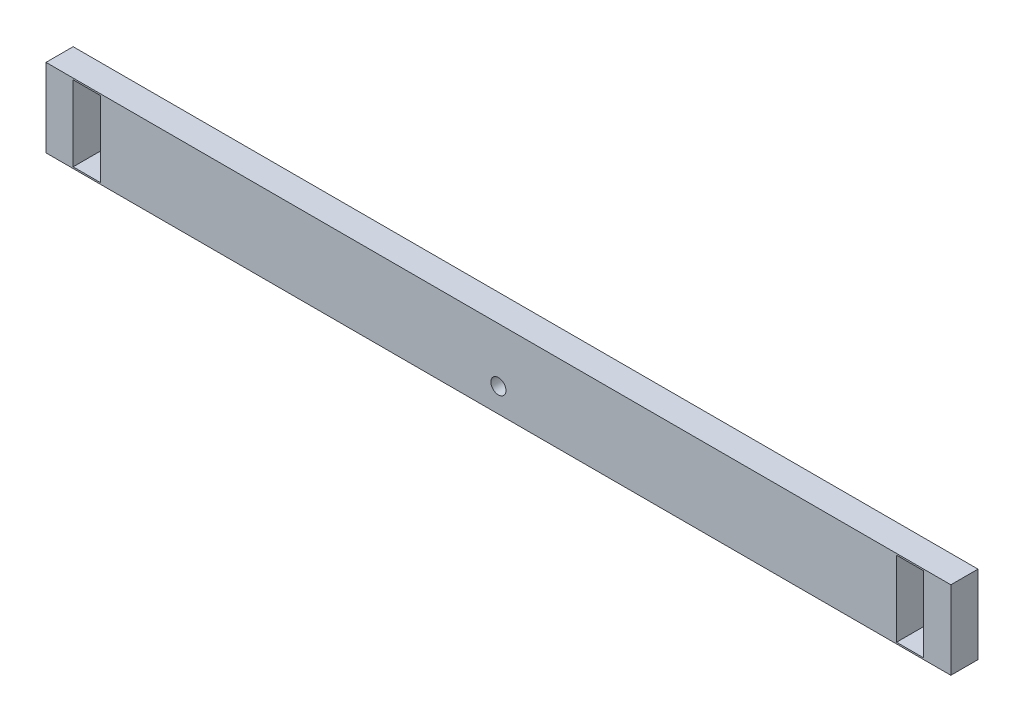
ISO-10303-21;
HEADER;
FILE_DESCRIPTION(('STEP AP214'),'2;1');
FILE_NAME('part.step','',(''),(''),'','','');
FILE_SCHEMA(('AUTOMOTIVE_DESIGN { 1 0 10303 214 1 1 1 1 }'));
ENDSEC;
DATA;
#1=APPLICATION_CONTEXT('core data for automotive mechanical design processes');
#2=APPLICATION_PROTOCOL_DEFINITION('international standard','automotive_design',2000,#1);
#3=PRODUCT_CONTEXT('',#1,'mechanical');
#4=PRODUCT('Part','Part','',(#3));
#5=PRODUCT_RELATED_PRODUCT_CATEGORY('part','',(#4));
#6=PRODUCT_DEFINITION_FORMATION('','',#4);
#7=PRODUCT_DEFINITION_CONTEXT('part definition',#1,'design');
#8=PRODUCT_DEFINITION('design','',#6,#7);
#9=PRODUCT_DEFINITION_SHAPE('','',#8);
#10=(LENGTH_UNIT() NAMED_UNIT(*) SI_UNIT(.MILLI.,.METRE.));
#11=(NAMED_UNIT(*) PLANE_ANGLE_UNIT() SI_UNIT($,.RADIAN.));
#12=(NAMED_UNIT(*) SI_UNIT($,.STERADIAN.) SOLID_ANGLE_UNIT());
#13=UNCERTAINTY_MEASURE_WITH_UNIT(LENGTH_MEASURE(1.E-05),#10,'distance_accuracy_value','');
#14=(GEOMETRIC_REPRESENTATION_CONTEXT(3) GLOBAL_UNCERTAINTY_ASSIGNED_CONTEXT((#13)) GLOBAL_UNIT_ASSIGNED_CONTEXT((#10,
#11,#12)) REPRESENTATION_CONTEXT('',''));
#15=CARTESIAN_POINT('',(0.,0.,0.));
#16=DIRECTION('',(0.,0.,1.));
#17=DIRECTION('',(1.,0.,0.));
#18=AXIS2_PLACEMENT_3D('',#15,#16,#17);
#19=CARTESIAN_POINT('',(0.,0.,18.));
#20=DIRECTION('',(0.,0.,1.));
#21=DIRECTION('',(1.,0.,0.));
#22=AXIS2_PLACEMENT_3D('',#19,#20,#21);
#23=PLANE('',#22);
#24=DIRECTION('',(0.,-1.,0.));
#25=VECTOR('',#24,1.);
#26=CARTESIAN_POINT('',(0.,0.,18.));
#27=LINE('',#26,#25);
#28=CARTESIAN_POINT('',(0.,0.,18.));
#29=VERTEX_POINT('',#28);
#30=CARTESIAN_POINT('',(0.,-52.,18.));
#31=VERTEX_POINT('',#30);
#32=EDGE_CURVE('E197',#29,#31,#27,.T.);
#33=ORIENTED_EDGE('',*,*,#32,.T.);
#34=DIRECTION('',(1.,0.,0.));
#35=VECTOR('',#34,1.);
#36=CARTESIAN_POINT('',(0.,-52.,18.));
#37=LINE('',#36,#35);
#38=CARTESIAN_POINT('',(600.,-51.9999999999999,18.));
#39=VERTEX_POINT('',#38);
#40=EDGE_CURVE('E200',#31,#39,#37,.T.);
#41=ORIENTED_EDGE('',*,*,#40,.T.);
#42=DIRECTION('',(0.,1.,0.));
#43=VECTOR('',#42,1.);
#44=CARTESIAN_POINT('',(600.,0.,18.));
#45=LINE('',#44,#43);
#46=CARTESIAN_POINT('',(600.,0.,18.));
#47=VERTEX_POINT('',#46);
#48=EDGE_CURVE('E203',#39,#47,#45,.T.);
#49=ORIENTED_EDGE('',*,*,#48,.T.);
#50=DIRECTION('',(-1.,0.,0.));
#51=VECTOR('',#50,1.);
#52=CARTESIAN_POINT('',(0.,0.,18.));
#53=LINE('',#52,#51);
#54=EDGE_CURVE('E205',#47,#29,#53,.T.);
#55=ORIENTED_EDGE('',*,*,#54,.T.);
#56=EDGE_LOOP('',(#33,#41,#49,#55));
#57=FACE_BOUND('',#56,.T.);
#58=CARTESIAN_POINT('',(300.,-36.,18.));
#59=DIRECTION('',(0.,0.,1.));
#60=DIRECTION('',(1.,0.,0.));
#61=AXIS2_PLACEMENT_3D('',#58,#59,#60);
#62=CIRCLE('',#61,4.99999999999999);
#63=CARTESIAN_POINT('',(305.,-36.,18.));
#64=VERTEX_POINT('',#63);
#65=EDGE_CURVE('E191',#64,#64,#62,.T.);
#66=ORIENTED_EDGE('',*,*,#65,.F.);
#67=EDGE_LOOP('',(#66));
#68=FACE_BOUND('',#67,.T.);
#69=DIRECTION('',(-1.,0.,0.));
#70=VECTOR('',#69,1.);
#71=CARTESIAN_POINT('',(18.,-0.99999999999998,18.));
#72=LINE('',#71,#70);
#73=CARTESIAN_POINT('',(36.,-0.99999999999998,18.));
#74=VERTEX_POINT('',#73);
#75=CARTESIAN_POINT('',(18.,-0.99999999999998,18.));
#76=VERTEX_POINT('',#75);
#77=EDGE_CURVE('E162',#74,#76,#72,.T.);
#78=ORIENTED_EDGE('',*,*,#77,.F.);
#79=DIRECTION('',(0.,1.,0.));
#80=VECTOR('',#79,1.);
#81=CARTESIAN_POINT('',(36.,-0.99999999999998,18.));
#82=LINE('',#81,#80);
#83=CARTESIAN_POINT('',(36.,-51.,18.));
#84=VERTEX_POINT('',#83);
#85=EDGE_CURVE('E160',#84,#74,#82,.T.);
#86=ORIENTED_EDGE('',*,*,#85,.F.);
#87=DIRECTION('',(1.,0.,0.));
#88=VECTOR('',#87,1.);
#89=CARTESIAN_POINT('',(18.,-51.,18.));
#90=LINE('',#89,#88);
#91=CARTESIAN_POINT('',(18.,-51.,18.));
#92=VERTEX_POINT('',#91);
#93=EDGE_CURVE('E168',#92,#84,#90,.T.);
#94=ORIENTED_EDGE('',*,*,#93,.F.);
#95=DIRECTION('',(0.,-1.,0.));
#96=VECTOR('',#95,1.);
#97=CARTESIAN_POINT('',(18.,-0.99999999999998,18.));
#98=LINE('',#97,#96);
#99=EDGE_CURVE('E165',#76,#92,#98,.T.);
#100=ORIENTED_EDGE('',*,*,#99,.F.);
#101=EDGE_LOOP('',(#78,#86,#94,#100));
#102=FACE_BOUND('',#101,.T.);
#103=DIRECTION('',(-1.,0.,0.));
#104=VECTOR('',#103,1.);
#105=CARTESIAN_POINT('',(582.,-0.999999999999911,18.));
#106=LINE('',#105,#104);
#107=CARTESIAN_POINT('',(582.,-0.999999999999911,18.));
#108=VERTEX_POINT('',#107);
#109=CARTESIAN_POINT('',(564.,-0.999999999999914,18.));
#110=VERTEX_POINT('',#109);
#111=EDGE_CURVE('E132',#108,#110,#106,.T.);
#112=ORIENTED_EDGE('',*,*,#111,.F.);
#113=DIRECTION('',(0.,1.,0.));
#114=VECTOR('',#113,1.);
#115=CARTESIAN_POINT('',(582.,-0.999999999999911,18.));
#116=LINE('',#115,#114);
#117=CARTESIAN_POINT('',(582.,-50.9999999999999,18.));
#118=VERTEX_POINT('',#117);
#119=EDGE_CURVE('E124',#118,#108,#116,.T.);
#120=ORIENTED_EDGE('',*,*,#119,.F.);
#121=DIRECTION('',(1.,0.,0.));
#122=VECTOR('',#121,1.);
#123=CARTESIAN_POINT('',(582.,-50.9999999999999,18.));
#124=LINE('',#123,#122);
#125=CARTESIAN_POINT('',(564.,-50.9999999999999,18.));
#126=VERTEX_POINT('',#125);
#127=EDGE_CURVE('E146',#126,#118,#124,.T.);
#128=ORIENTED_EDGE('',*,*,#127,.F.);
#129=DIRECTION('',(0.,-1.,0.));
#130=VECTOR('',#129,1.);
#131=CARTESIAN_POINT('',(564.,-0.999999999999914,18.));
#132=LINE('',#131,#130);
#133=EDGE_CURVE('E144',#110,#126,#132,.T.);
#134=ORIENTED_EDGE('',*,*,#133,.F.);
#135=EDGE_LOOP('',(#112,#120,#128,#134));
#136=FACE_BOUND('',#135,.T.);
#137=ADVANCED_FACE('F35',(#57,#68,#102,#136),#23,.T.);
#138=CARTESIAN_POINT('',(0.,0.,0.));
#139=DIRECTION('',(0.,0.,1.));
#140=DIRECTION('',(1.,0.,0.));
#141=AXIS2_PLACEMENT_3D('',#138,#139,#140);
#142=PLANE('',#141);
#143=DIRECTION('',(0.,1.,0.));
#144=VECTOR('',#143,1.);
#145=CARTESIAN_POINT('',(36.,-0.99999999999998,0.));
#146=LINE('',#145,#144);
#147=CARTESIAN_POINT('',(36.,-51.,0.));
#148=VERTEX_POINT('',#147);
#149=CARTESIAN_POINT('',(36.,-0.99999999999998,0.));
#150=VERTEX_POINT('',#149);
#151=EDGE_CURVE('E140',#148,#150,#146,.T.);
#152=ORIENTED_EDGE('',*,*,#151,.T.);
#153=DIRECTION('',(-1.,0.,0.));
#154=VECTOR('',#153,1.);
#155=CARTESIAN_POINT('',(18.,-0.99999999999998,0.));
#156=LINE('',#155,#154);
#157=CARTESIAN_POINT('',(18.,-0.99999999999998,0.));
#158=VERTEX_POINT('',#157);
#159=EDGE_CURVE('E173',#150,#158,#156,.T.);
#160=ORIENTED_EDGE('',*,*,#159,.T.);
#161=DIRECTION('',(0.,-1.,0.));
#162=VECTOR('',#161,1.);
#163=CARTESIAN_POINT('',(18.,-0.99999999999998,0.));
#164=LINE('',#163,#162);
#165=CARTESIAN_POINT('',(18.,-51.,0.));
#166=VERTEX_POINT('',#165);
#167=EDGE_CURVE('E176',#158,#166,#164,.T.);
#168=ORIENTED_EDGE('',*,*,#167,.T.);
#169=DIRECTION('',(1.,0.,0.));
#170=VECTOR('',#169,1.);
#171=CARTESIAN_POINT('',(18.,-51.,0.));
#172=LINE('',#171,#170);
#173=EDGE_CURVE('E163',#166,#148,#172,.T.);
#174=ORIENTED_EDGE('',*,*,#173,.T.);
#175=EDGE_LOOP('',(#152,#160,#168,#174));
#176=FACE_BOUND('',#175,.T.);
#177=DIRECTION('',(0.,-1.,0.));
#178=VECTOR('',#177,1.);
#179=CARTESIAN_POINT('',(0.,0.,0.));
#180=LINE('',#179,#178);
#181=CARTESIAN_POINT('',(0.,0.,0.));
#182=VERTEX_POINT('',#181);
#183=CARTESIAN_POINT('',(0.,-52.,0.));
#184=VERTEX_POINT('',#183);
#185=EDGE_CURVE('E194',#182,#184,#180,.T.);
#186=ORIENTED_EDGE('',*,*,#185,.F.);
#187=DIRECTION('',(-1.,0.,0.));
#188=VECTOR('',#187,1.);
#189=CARTESIAN_POINT('',(0.,0.,0.));
#190=LINE('',#189,#188);
#191=CARTESIAN_POINT('',(600.,0.,0.));
#192=VERTEX_POINT('',#191);
#193=EDGE_CURVE('E201',#192,#182,#190,.T.);
#194=ORIENTED_EDGE('',*,*,#193,.F.);
#195=DIRECTION('',(0.,1.,0.));
#196=VECTOR('',#195,1.);
#197=CARTESIAN_POINT('',(600.,0.,0.));
#198=LINE('',#197,#196);
#199=CARTESIAN_POINT('',(600.,-51.9999999999999,0.));
#200=VERTEX_POINT('',#199);
#201=EDGE_CURVE('E212',#200,#192,#198,.T.);
#202=ORIENTED_EDGE('',*,*,#201,.F.);
#203=DIRECTION('',(1.,0.,0.));
#204=VECTOR('',#203,1.);
#205=CARTESIAN_POINT('',(307.,-51.9999999999999,0.));
#206=LINE('',#205,#204);
#207=EDGE_CURVE('E210',#184,#200,#206,.T.);
#208=ORIENTED_EDGE('',*,*,#207,.F.);
#209=EDGE_LOOP('',(#186,#194,#202,#208));
#210=FACE_BOUND('',#209,.T.);
#211=CARTESIAN_POINT('',(300.,-36.,0.));
#212=DIRECTION('',(0.,0.,1.));
#213=DIRECTION('',(1.,0.,0.));
#214=AXIS2_PLACEMENT_3D('',#211,#212,#213);
#215=CIRCLE('',#214,4.99999999999999);
#216=CARTESIAN_POINT('',(305.,-36.,0.));
#217=VERTEX_POINT('',#216);
#218=EDGE_CURVE('E190',#217,#217,#215,.T.);
#219=ORIENTED_EDGE('',*,*,#218,.T.);
#220=EDGE_LOOP('',(#219));
#221=FACE_BOUND('',#220,.T.);
#222=DIRECTION('',(0.,1.,0.));
#223=VECTOR('',#222,1.);
#224=CARTESIAN_POINT('',(582.,-0.999999999999911,0.));
#225=LINE('',#224,#223);
#226=CARTESIAN_POINT('',(582.,-50.9999999999999,0.));
#227=VERTEX_POINT('',#226);
#228=CARTESIAN_POINT('',(582.,-0.999999999999911,0.));
#229=VERTEX_POINT('',#228);
#230=EDGE_CURVE('E58',#227,#229,#225,.T.);
#231=ORIENTED_EDGE('',*,*,#230,.T.);
#232=DIRECTION('',(-1.,0.,0.));
#233=VECTOR('',#232,1.);
#234=CARTESIAN_POINT('',(582.,-0.999999999999911,0.));
#235=LINE('',#234,#233);
#236=CARTESIAN_POINT('',(564.,-0.999999999999914,0.));
#237=VERTEX_POINT('',#236);
#238=EDGE_CURVE('E139',#229,#237,#235,.T.);
#239=ORIENTED_EDGE('',*,*,#238,.T.);
#240=DIRECTION('',(0.,-1.,0.));
#241=VECTOR('',#240,1.);
#242=CARTESIAN_POINT('',(564.,-0.999999999999914,0.));
#243=LINE('',#242,#241);
#244=CARTESIAN_POINT('',(564.,-50.9999999999999,0.));
#245=VERTEX_POINT('',#244);
#246=EDGE_CURVE('E152',#237,#245,#243,.T.);
#247=ORIENTED_EDGE('',*,*,#246,.T.);
#248=DIRECTION('',(1.,0.,0.));
#249=VECTOR('',#248,1.);
#250=CARTESIAN_POINT('',(582.,-50.9999999999999,0.));
#251=LINE('',#250,#249);
#252=EDGE_CURVE('E133',#245,#227,#251,.T.);
#253=ORIENTED_EDGE('',*,*,#252,.T.);
#254=EDGE_LOOP('',(#231,#239,#247,#253));
#255=FACE_BOUND('',#254,.T.);
#256=ADVANCED_FACE('F230',(#176,#210,#221,#255),#142,.F.);
#257=CARTESIAN_POINT('',(0.,0.,18.));
#258=DIRECTION('',(1.,0.,0.));
#259=DIRECTION('',(0.,0.,-1.));
#260=AXIS2_PLACEMENT_3D('',#257,#258,#259);
#261=PLANE('',#260);
#262=ORIENTED_EDGE('',*,*,#185,.T.);
#263=DIRECTION('',(0.,0.,-1.));
#264=VECTOR('',#263,1.);
#265=CARTESIAN_POINT('',(0.,-52.,18.));
#266=LINE('',#265,#264);
#267=EDGE_CURVE('E11',#31,#184,#266,.T.);
#268=ORIENTED_EDGE('',*,*,#267,.F.);
#269=ORIENTED_EDGE('',*,*,#32,.F.);
#270=DIRECTION('',(0.,0.,-1.));
#271=VECTOR('',#270,1.);
#272=CARTESIAN_POINT('',(0.,0.,18.));
#273=LINE('',#272,#271);
#274=EDGE_CURVE('E207',#29,#182,#273,.T.);
#275=ORIENTED_EDGE('',*,*,#274,.T.);
#276=EDGE_LOOP('',(#262,#268,#269,#275));
#277=FACE_BOUND('',#276,.T.);
#278=ADVANCED_FACE('F37',(#277),#261,.F.);
#279=CARTESIAN_POINT('',(307.,-51.9999999999999,18.));
#280=DIRECTION('',(0.,1.,0.));
#281=DIRECTION('',(-1.,0.,0.));
#282=AXIS2_PLACEMENT_3D('',#279,#280,#281);
#283=PLANE('',#282);
#284=ORIENTED_EDGE('',*,*,#207,.T.);
#285=DIRECTION('',(0.,0.,-1.));
#286=VECTOR('',#285,1.);
#287=CARTESIAN_POINT('',(600.,-51.9999999999999,18.));
#288=LINE('',#287,#286);
#289=EDGE_CURVE('E43',#39,#200,#288,.T.);
#290=ORIENTED_EDGE('',*,*,#289,.F.);
#291=ORIENTED_EDGE('',*,*,#40,.F.);
#292=ORIENTED_EDGE('',*,*,#267,.T.);
#293=EDGE_LOOP('',(#284,#290,#291,#292));
#294=FACE_BOUND('',#293,.T.);
#295=ADVANCED_FACE('F241',(#294),#283,.F.);
#296=CARTESIAN_POINT('',(600.,0.,18.));
#297=DIRECTION('',(-1.,0.,0.));
#298=DIRECTION('',(0.,0.,1.));
#299=AXIS2_PLACEMENT_3D('',#296,#297,#298);
#300=PLANE('',#299);
#301=ORIENTED_EDGE('',*,*,#201,.T.);
#302=DIRECTION('',(0.,0.,-1.));
#303=VECTOR('',#302,1.);
#304=CARTESIAN_POINT('',(600.,0.,18.));
#305=LINE('',#304,#303);
#306=EDGE_CURVE('E217',#47,#192,#305,.T.);
#307=ORIENTED_EDGE('',*,*,#306,.F.);
#308=ORIENTED_EDGE('',*,*,#48,.F.);
#309=ORIENTED_EDGE('',*,*,#289,.T.);
#310=EDGE_LOOP('',(#301,#307,#308,#309));
#311=FACE_BOUND('',#310,.T.);
#312=ADVANCED_FACE('F224',(#311),#300,.F.);
#313=CARTESIAN_POINT('',(0.,0.,18.));
#314=DIRECTION('',(0.,-1.,0.));
#315=DIRECTION('',(1.,0.,0.));
#316=AXIS2_PLACEMENT_3D('',#313,#314,#315);
#317=PLANE('',#316);
#318=ORIENTED_EDGE('',*,*,#193,.T.);
#319=ORIENTED_EDGE('',*,*,#274,.F.);
#320=ORIENTED_EDGE('',*,*,#54,.F.);
#321=ORIENTED_EDGE('',*,*,#306,.T.);
#322=EDGE_LOOP('',(#318,#319,#320,#321));
#323=FACE_BOUND('',#322,.T.);
#324=ADVANCED_FACE('F234',(#323),#317,.F.);
#325=CARTESIAN_POINT('',(300.,-36.,18.));
#326=DIRECTION('',(0.,0.,-1.));
#327=DIRECTION('',(-1.,0.,0.));
#328=AXIS2_PLACEMENT_3D('',#325,#326,#327);
#329=CYLINDRICAL_SURFACE('',#328,4.99999999999999);
#330=ORIENTED_EDGE('',*,*,#65,.T.);
#331=EDGE_LOOP('',(#330));
#332=FACE_BOUND('',#331,.T.);
#333=ORIENTED_EDGE('',*,*,#218,.F.);
#334=EDGE_LOOP('',(#333));
#335=FACE_BOUND('',#334,.T.);
#336=ADVANCED_FACE('F256',(#332,#335),#329,.F.);
#337=CARTESIAN_POINT('',(36.,-0.99999999999998,18.));
#338=DIRECTION('',(-1.,0.,0.));
#339=DIRECTION('',(0.,-1.,0.));
#340=AXIS2_PLACEMENT_3D('',#337,#338,#339);
#341=PLANE('',#340);
#342=ORIENTED_EDGE('',*,*,#151,.F.);
#343=DIRECTION('',(0.,0.,-1.));
#344=VECTOR('',#343,1.);
#345=CARTESIAN_POINT('',(36.,-51.,18.));
#346=LINE('',#345,#344);
#347=EDGE_CURVE('E170',#84,#148,#346,.T.);
#348=ORIENTED_EDGE('',*,*,#347,.F.);
#349=ORIENTED_EDGE('',*,*,#85,.T.);
#350=DIRECTION('',(0.,0.,-1.));
#351=VECTOR('',#350,1.);
#352=CARTESIAN_POINT('',(36.,-0.99999999999998,18.));
#353=LINE('',#352,#351);
#354=EDGE_CURVE('E187',#74,#150,#353,.T.);
#355=ORIENTED_EDGE('',*,*,#354,.T.);
#356=EDGE_LOOP('',(#342,#348,#349,#355));
#357=FACE_BOUND('',#356,.T.);
#358=ADVANCED_FACE('F263',(#357),#341,.T.);
#359=CARTESIAN_POINT('',(18.,-0.99999999999998,18.));
#360=DIRECTION('',(0.,-1.,0.));
#361=DIRECTION('',(0.,0.,-1.));
#362=AXIS2_PLACEMENT_3D('',#359,#360,#361);
#363=PLANE('',#362);
#364=ORIENTED_EDGE('',*,*,#159,.F.);
#365=ORIENTED_EDGE('',*,*,#354,.F.);
#366=ORIENTED_EDGE('',*,*,#77,.T.);
#367=DIRECTION('',(0.,0.,-1.));
#368=VECTOR('',#367,1.);
#369=CARTESIAN_POINT('',(18.,-0.99999999999998,18.));
#370=LINE('',#369,#368);
#371=EDGE_CURVE('E185',#76,#158,#370,.T.);
#372=ORIENTED_EDGE('',*,*,#371,.T.);
#373=EDGE_LOOP('',(#364,#365,#366,#372));
#374=FACE_BOUND('',#373,.T.);
#375=ADVANCED_FACE('F268',(#374),#363,.T.);
#376=CARTESIAN_POINT('',(18.,-0.99999999999998,18.));
#377=DIRECTION('',(1.,0.,0.));
#378=DIRECTION('',(0.,1.,0.));
#379=AXIS2_PLACEMENT_3D('',#376,#377,#378);
#380=PLANE('',#379);
#381=ORIENTED_EDGE('',*,*,#167,.F.);
#382=ORIENTED_EDGE('',*,*,#371,.F.);
#383=ORIENTED_EDGE('',*,*,#99,.T.);
#384=DIRECTION('',(0.,0.,-1.));
#385=VECTOR('',#384,1.);
#386=CARTESIAN_POINT('',(18.,-51.,18.));
#387=LINE('',#386,#385);
#388=EDGE_CURVE('E183',#92,#166,#387,.T.);
#389=ORIENTED_EDGE('',*,*,#388,.T.);
#390=EDGE_LOOP('',(#381,#382,#383,#389));
#391=FACE_BOUND('',#390,.T.);
#392=ADVANCED_FACE('F292',(#391),#380,.T.);
#393=CARTESIAN_POINT('',(18.,-51.,18.));
#394=DIRECTION('',(0.,1.,0.));
#395=DIRECTION('',(0.,0.,1.));
#396=AXIS2_PLACEMENT_3D('',#393,#394,#395);
#397=PLANE('',#396);
#398=ORIENTED_EDGE('',*,*,#173,.F.);
#399=ORIENTED_EDGE('',*,*,#388,.F.);
#400=ORIENTED_EDGE('',*,*,#93,.T.);
#401=ORIENTED_EDGE('',*,*,#347,.T.);
#402=EDGE_LOOP('',(#398,#399,#400,#401));
#403=FACE_BOUND('',#402,.T.);
#404=ADVANCED_FACE('F289',(#403),#397,.T.);
#405=CARTESIAN_POINT('',(582.,-0.999999999999911,18.));
#406=DIRECTION('',(-1.,0.,0.));
#407=DIRECTION('',(0.,0.,1.));
#408=AXIS2_PLACEMENT_3D('',#405,#406,#407);
#409=PLANE('',#408);
#410=ORIENTED_EDGE('',*,*,#230,.F.);
#411=DIRECTION('',(0.,0.,-1.));
#412=VECTOR('',#411,1.);
#413=CARTESIAN_POINT('',(582.,-50.9999999999999,18.));
#414=LINE('',#413,#412);
#415=EDGE_CURVE('E128',#118,#227,#414,.T.);
#416=ORIENTED_EDGE('',*,*,#415,.F.);
#417=ORIENTED_EDGE('',*,*,#119,.T.);
#418=DIRECTION('',(0.,0.,-1.));
#419=VECTOR('',#418,1.);
#420=CARTESIAN_POINT('',(582.,-0.999999999999911,18.));
#421=LINE('',#420,#419);
#422=EDGE_CURVE('E127',#108,#229,#421,.T.);
#423=ORIENTED_EDGE('',*,*,#422,.T.);
#424=EDGE_LOOP('',(#410,#416,#417,#423));
#425=FACE_BOUND('',#424,.T.);
#426=ADVANCED_FACE('F126',(#425),#409,.T.);
#427=CARTESIAN_POINT('',(582.,-0.999999999999911,18.));
#428=DIRECTION('',(0.,-1.,0.));
#429=DIRECTION('',(1.,0.,0.));
#430=AXIS2_PLACEMENT_3D('',#427,#428,#429);
#431=PLANE('',#430);
#432=ORIENTED_EDGE('',*,*,#238,.F.);
#433=ORIENTED_EDGE('',*,*,#422,.F.);
#434=ORIENTED_EDGE('',*,*,#111,.T.);
#435=DIRECTION('',(0.,0.,-1.));
#436=VECTOR('',#435,1.);
#437=CARTESIAN_POINT('',(564.,-0.999999999999914,18.));
#438=LINE('',#437,#436);
#439=EDGE_CURVE('E141',#110,#237,#438,.T.);
#440=ORIENTED_EDGE('',*,*,#439,.T.);
#441=EDGE_LOOP('',(#432,#433,#434,#440));
#442=FACE_BOUND('',#441,.T.);
#443=ADVANCED_FACE('F136',(#442),#431,.T.);
#444=CARTESIAN_POINT('',(564.,-0.999999999999914,18.));
#445=DIRECTION('',(1.,0.,0.));
#446=DIRECTION('',(0.,0.,-1.));
#447=AXIS2_PLACEMENT_3D('',#444,#445,#446);
#448=PLANE('',#447);
#449=ORIENTED_EDGE('',*,*,#246,.F.);
#450=ORIENTED_EDGE('',*,*,#439,.F.);
#451=ORIENTED_EDGE('',*,*,#133,.T.);
#452=DIRECTION('',(0.,0.,-1.));
#453=VECTOR('',#452,1.);
#454=CARTESIAN_POINT('',(564.,-50.9999999999999,18.));
#455=LINE('',#454,#453);
#456=EDGE_CURVE('E50',#126,#245,#455,.T.);
#457=ORIENTED_EDGE('',*,*,#456,.T.);
#458=EDGE_LOOP('',(#449,#450,#451,#457));
#459=FACE_BOUND('',#458,.T.);
#460=ADVANCED_FACE('F277',(#459),#448,.T.);
#461=CARTESIAN_POINT('',(582.,-50.9999999999999,18.));
#462=DIRECTION('',(0.,1.,0.));
#463=DIRECTION('',(-1.,0.,0.));
#464=AXIS2_PLACEMENT_3D('',#461,#462,#463);
#465=PLANE('',#464);
#466=ORIENTED_EDGE('',*,*,#252,.F.);
#467=ORIENTED_EDGE('',*,*,#456,.F.);
#468=ORIENTED_EDGE('',*,*,#127,.T.);
#469=ORIENTED_EDGE('',*,*,#415,.T.);
#470=EDGE_LOOP('',(#466,#467,#468,#469));
#471=FACE_BOUND('',#470,.T.);
#472=ADVANCED_FACE('F275',(#471),#465,.T.);
#473=CLOSED_SHELL('',(#137,#256,#278,#295,#312,#324,#336,#358,#375,#392,#404,#426,#443,#460,#472));
#474=MANIFOLD_SOLID_BREP('B2',#473);
#475=ADVANCED_BREP_SHAPE_REPRESENTATION('',(#18,#474),#14);
#476=SHAPE_DEFINITION_REPRESENTATION(#9,#475);
ENDSEC;
END-ISO-10303-21;
